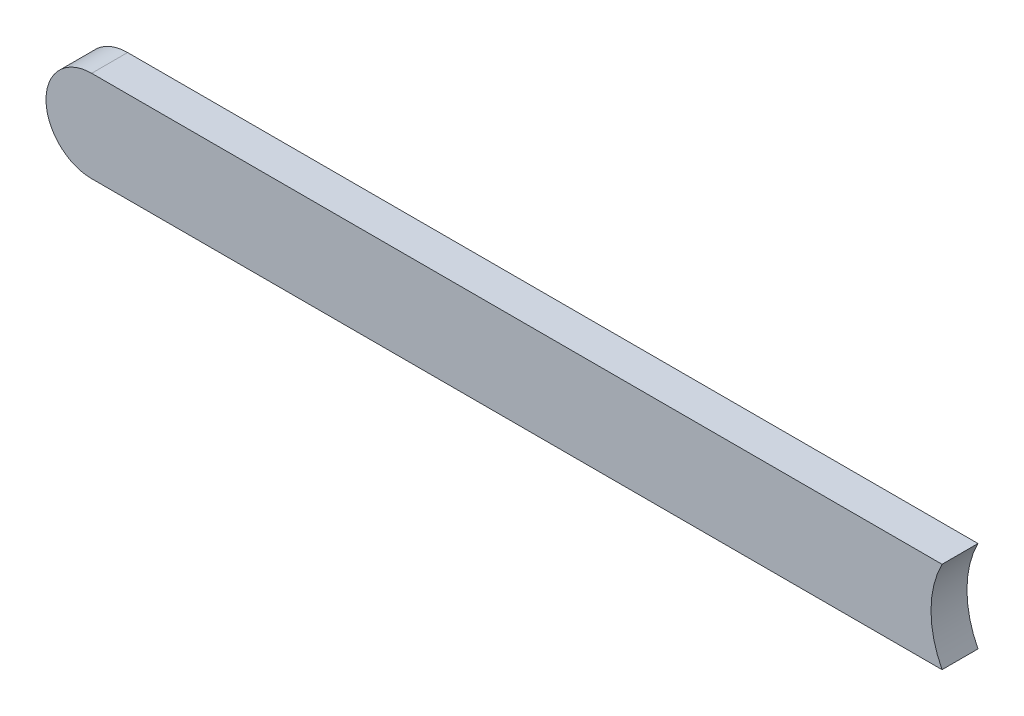
ISO-10303-21;
HEADER;
FILE_DESCRIPTION(('STEP AP214'),'2;1');
FILE_NAME('part.step','',(''),(''),'','','');
FILE_SCHEMA(('AUTOMOTIVE_DESIGN { 1 0 10303 214 1 1 1 1 }'));
ENDSEC;
DATA;
#1=APPLICATION_CONTEXT('core data for automotive mechanical design processes');
#2=APPLICATION_PROTOCOL_DEFINITION('international standard','automotive_design',2000,#1);
#3=PRODUCT_CONTEXT('',#1,'mechanical');
#4=PRODUCT('Part','Part','',(#3));
#5=PRODUCT_RELATED_PRODUCT_CATEGORY('part','',(#4));
#6=PRODUCT_DEFINITION_FORMATION('','',#4);
#7=PRODUCT_DEFINITION_CONTEXT('part definition',#1,'design');
#8=PRODUCT_DEFINITION('design','',#6,#7);
#9=PRODUCT_DEFINITION_SHAPE('','',#8);
#10=(LENGTH_UNIT() NAMED_UNIT(*) SI_UNIT(.MILLI.,.METRE.));
#11=(NAMED_UNIT(*) PLANE_ANGLE_UNIT() SI_UNIT($,.RADIAN.));
#12=(NAMED_UNIT(*) SI_UNIT($,.STERADIAN.) SOLID_ANGLE_UNIT());
#13=UNCERTAINTY_MEASURE_WITH_UNIT(LENGTH_MEASURE(1.E-05),#10,'distance_accuracy_value','');
#14=(GEOMETRIC_REPRESENTATION_CONTEXT(3) GLOBAL_UNCERTAINTY_ASSIGNED_CONTEXT((#13)) GLOBAL_UNIT_ASSIGNED_CONTEXT((#10,
#11,#12)) REPRESENTATION_CONTEXT('',''));
#15=CARTESIAN_POINT('',(0.,0.,0.));
#16=DIRECTION('',(0.,0.,1.));
#17=DIRECTION('',(1.,0.,0.));
#18=AXIS2_PLACEMENT_3D('',#15,#16,#17);
#19=CARTESIAN_POINT('',(108.5596,98.425,0.));
#20=DIRECTION('',(0.,1.,0.));
#21=DIRECTION('',(1.,0.,0.));
#22=AXIS2_PLACEMENT_3D('',#19,#20,#21);
#23=PLANE('',#22);
#24=DIRECTION('',(1.,0.,0.));
#25=VECTOR('',#24,1.);
#26=CARTESIAN_POINT('',(108.5596,98.425,0.1999996));
#27=LINE('',#26,#25);
#28=CARTESIAN_POINT('',(108.5596,98.425,0.1999996));
#29=VERTEX_POINT('',#28);
#30=CARTESIAN_POINT('',(113.291269109142,98.425,0.1999996));
#31=VERTEX_POINT('',#30);
#32=EDGE_CURVE('E11',#29,#31,#27,.T.);
#33=ORIENTED_EDGE('',*,*,#32,.F.);
#34=DIRECTION('',(0.,0.,1.));
#35=VECTOR('',#34,1.);
#36=CARTESIAN_POINT('',(108.5596,98.425,0.));
#37=LINE('',#36,#35);
#38=CARTESIAN_POINT('',(108.5596,98.425,0.));
#39=VERTEX_POINT('',#38);
#40=EDGE_CURVE('E24',#39,#29,#37,.T.);
#41=ORIENTED_EDGE('',*,*,#40,.F.);
#42=DIRECTION('',(1.,0.,0.));
#43=VECTOR('',#42,1.);
#44=CARTESIAN_POINT('',(108.5596,98.425,0.));
#45=LINE('',#44,#43);
#46=CARTESIAN_POINT('',(113.291269109142,98.425,0.));
#47=VERTEX_POINT('',#46);
#48=EDGE_CURVE('E75',#39,#47,#45,.T.);
#49=ORIENTED_EDGE('',*,*,#48,.T.);
#50=DIRECTION('',(0.,0.,1.));
#51=VECTOR('',#50,1.);
#52=CARTESIAN_POINT('',(113.291269109142,98.425,0.));
#53=LINE('',#52,#51);
#54=EDGE_CURVE('E37',#47,#31,#53,.T.);
#55=ORIENTED_EDGE('',*,*,#54,.T.);
#56=EDGE_LOOP('',(#33,#41,#49,#55));
#57=FACE_BOUND('',#56,.T.);
#58=ADVANCED_FACE('F17',(#57),#23,.F.);
#59=CARTESIAN_POINT('',(113.7847356,98.679,0.));
#60=DIRECTION('',(0.,0.,-1.));
#61=DIRECTION('',(1.,0.,0.));
#62=AXIS2_PLACEMENT_3D('',#59,#60,#61);
#63=CYLINDRICAL_SURFACE('',#62,0.55500016);
#64=DIRECTION('',(0.,0.,1.));
#65=VECTOR('',#64,1.);
#66=CARTESIAN_POINT('',(113.291269109142,98.933,0.));
#67=LINE('',#66,#65);
#68=CARTESIAN_POINT('',(113.291269109142,98.933,0.));
#69=VERTEX_POINT('',#68);
#70=CARTESIAN_POINT('',(113.291269109142,98.933,0.1999996));
#71=VERTEX_POINT('',#70);
#72=EDGE_CURVE('E67',#69,#71,#67,.T.);
#73=ORIENTED_EDGE('',*,*,#72,.T.);
#74=CARTESIAN_POINT('',(113.7847356,98.679,0.1999996));
#75=DIRECTION('',(0.,0.,1.));
#76=DIRECTION('',(1.,0.,0.));
#77=AXIS2_PLACEMENT_3D('',#74,#75,#76);
#78=CIRCLE('',#77,0.55500016);
#79=EDGE_CURVE('E82',#71,#31,#78,.T.);
#80=ORIENTED_EDGE('',*,*,#79,.T.);
#81=ORIENTED_EDGE('',*,*,#54,.F.);
#82=CARTESIAN_POINT('',(113.7847356,98.679,0.));
#83=DIRECTION('',(0.,0.,1.));
#84=DIRECTION('',(1.,0.,0.));
#85=AXIS2_PLACEMENT_3D('',#82,#83,#84);
#86=CIRCLE('',#85,0.55500016);
#87=EDGE_CURVE('E80',#69,#47,#86,.T.);
#88=ORIENTED_EDGE('',*,*,#87,.F.);
#89=EDGE_LOOP('',(#73,#80,#81,#88));
#90=FACE_BOUND('',#89,.T.);
#91=ADVANCED_FACE('F88',(#90),#63,.F.);
#92=CARTESIAN_POINT('',(113.291269109142,98.933,0.));
#93=DIRECTION('',(0.,-1.,0.));
#94=DIRECTION('',(-1.,0.,0.));
#95=AXIS2_PLACEMENT_3D('',#92,#93,#94);
#96=PLANE('',#95);
#97=DIRECTION('',(-1.,0.,0.));
#98=VECTOR('',#97,1.);
#99=CARTESIAN_POINT('',(113.7847356,98.933,0.1999996));
#100=LINE('',#99,#98);
#101=CARTESIAN_POINT('',(108.5596,98.933,0.1999996));
#102=VERTEX_POINT('',#101);
#103=EDGE_CURVE('E71',#71,#102,#100,.T.);
#104=ORIENTED_EDGE('',*,*,#103,.F.);
#105=ORIENTED_EDGE('',*,*,#72,.F.);
#106=DIRECTION('',(-1.,0.,0.));
#107=VECTOR('',#106,1.);
#108=CARTESIAN_POINT('',(113.7847356,98.933,0.));
#109=LINE('',#108,#107);
#110=CARTESIAN_POINT('',(108.5596,98.933,0.));
#111=VERTEX_POINT('',#110);
#112=EDGE_CURVE('E63',#69,#111,#109,.T.);
#113=ORIENTED_EDGE('',*,*,#112,.T.);
#114=DIRECTION('',(0.,0.,1.));
#115=VECTOR('',#114,1.);
#116=CARTESIAN_POINT('',(108.5596,98.933,0.));
#117=LINE('',#116,#115);
#118=EDGE_CURVE('E53',#111,#102,#117,.T.);
#119=ORIENTED_EDGE('',*,*,#118,.T.);
#120=EDGE_LOOP('',(#104,#105,#113,#119));
#121=FACE_BOUND('',#120,.T.);
#122=ADVANCED_FACE('F66',(#121),#96,.F.);
#123=CARTESIAN_POINT('',(108.5596,98.679,0.));
#124=DIRECTION('',(0.,0.,-1.));
#125=DIRECTION('',(0.,1.,0.));
#126=AXIS2_PLACEMENT_3D('',#123,#124,#125);
#127=CYLINDRICAL_SURFACE('',#126,0.25400000000001);
#128=CARTESIAN_POINT('',(108.5596,98.679,0.1999996));
#129=DIRECTION('',(0.,0.,1.));
#130=DIRECTION('',(0.,1.,0.));
#131=AXIS2_PLACEMENT_3D('',#128,#129,#130);
#132=CIRCLE('',#131,0.25400000000001);
#133=EDGE_CURVE('E59',#102,#29,#132,.T.);
#134=ORIENTED_EDGE('',*,*,#133,.F.);
#135=ORIENTED_EDGE('',*,*,#118,.F.);
#136=CARTESIAN_POINT('',(108.5596,98.679,0.));
#137=DIRECTION('',(0.,0.,1.));
#138=DIRECTION('',(0.,1.,0.));
#139=AXIS2_PLACEMENT_3D('',#136,#137,#138);
#140=CIRCLE('',#139,0.25400000000001);
#141=EDGE_CURVE('E57',#111,#39,#140,.T.);
#142=ORIENTED_EDGE('',*,*,#141,.T.);
#143=ORIENTED_EDGE('',*,*,#40,.T.);
#144=EDGE_LOOP('',(#134,#135,#142,#143));
#145=FACE_BOUND('',#144,.T.);
#146=ADVANCED_FACE('F55',(#145),#127,.T.);
#147=CARTESIAN_POINT('',(108.5596,98.425,0.));
#148=DIRECTION('',(0.,0.,-1.));
#149=DIRECTION('',(-1.,0.,0.));
#150=AXIS2_PLACEMENT_3D('',#147,#148,#149);
#151=PLANE('',#150);
#152=ORIENTED_EDGE('',*,*,#48,.F.);
#153=ORIENTED_EDGE('',*,*,#141,.F.);
#154=ORIENTED_EDGE('',*,*,#112,.F.);
#155=ORIENTED_EDGE('',*,*,#87,.T.);
#156=EDGE_LOOP('',(#152,#153,#154,#155));
#157=FACE_BOUND('',#156,.T.);
#158=ADVANCED_FACE('F74',(#157),#151,.T.);
#159=CARTESIAN_POINT('',(108.5596,98.425,0.1999996));
#160=DIRECTION('',(0.,0.,-1.));
#161=DIRECTION('',(-1.,0.,0.));
#162=AXIS2_PLACEMENT_3D('',#159,#160,#161);
#163=PLANE('',#162);
#164=ORIENTED_EDGE('',*,*,#133,.T.);
#165=ORIENTED_EDGE('',*,*,#32,.T.);
#166=ORIENTED_EDGE('',*,*,#79,.F.);
#167=ORIENTED_EDGE('',*,*,#103,.T.);
#168=EDGE_LOOP('',(#164,#165,#166,#167));
#169=FACE_BOUND('',#168,.T.);
#170=ADVANCED_FACE('F91',(#169),#163,.F.);
#171=CLOSED_SHELL('',(#58,#91,#122,#146,#158,#170));
#172=MANIFOLD_SOLID_BREP('B1',#171);
#173=ADVANCED_BREP_SHAPE_REPRESENTATION('',(#18,#172),#14);
#174=SHAPE_DEFINITION_REPRESENTATION(#9,#173);
ENDSEC;
END-ISO-10303-21;
